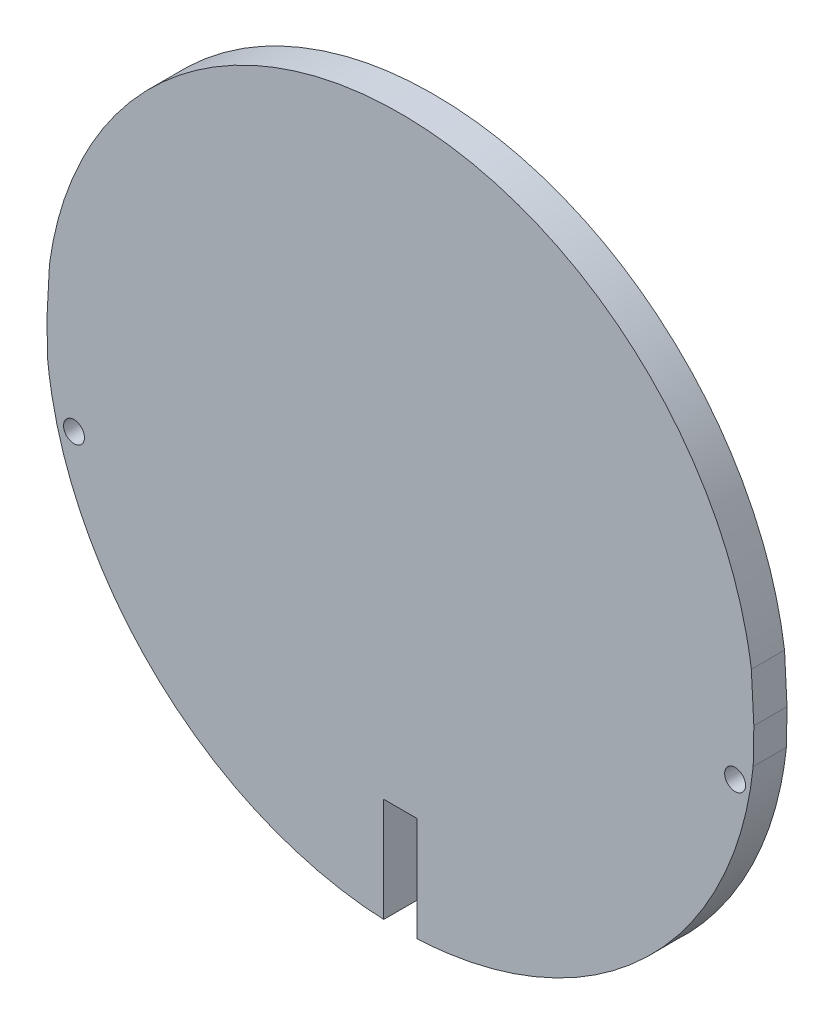
ISO-10303-21;
HEADER;
FILE_DESCRIPTION(('STEP AP214'),'2;1');
FILE_NAME('part.step','',(''),(''),'','','');
FILE_SCHEMA(('AUTOMOTIVE_DESIGN { 1 0 10303 214 1 1 1 1 }'));
ENDSEC;
DATA;
#1=APPLICATION_CONTEXT('core data for automotive mechanical design processes');
#2=APPLICATION_PROTOCOL_DEFINITION('international standard','automotive_design',2000,#1);
#3=PRODUCT_CONTEXT('',#1,'mechanical');
#4=PRODUCT('Part','Part','',(#3));
#5=PRODUCT_RELATED_PRODUCT_CATEGORY('part','',(#4));
#6=PRODUCT_DEFINITION_FORMATION('','',#4);
#7=PRODUCT_DEFINITION_CONTEXT('part definition',#1,'design');
#8=PRODUCT_DEFINITION('design','',#6,#7);
#9=PRODUCT_DEFINITION_SHAPE('','',#8);
#10=(LENGTH_UNIT() NAMED_UNIT(*) SI_UNIT(.MILLI.,.METRE.));
#11=(NAMED_UNIT(*) PLANE_ANGLE_UNIT() SI_UNIT($,.RADIAN.));
#12=(NAMED_UNIT(*) SI_UNIT($,.STERADIAN.) SOLID_ANGLE_UNIT());
#13=UNCERTAINTY_MEASURE_WITH_UNIT(LENGTH_MEASURE(1.E-05),#10,'distance_accuracy_value','');
#14=(GEOMETRIC_REPRESENTATION_CONTEXT(3) GLOBAL_UNCERTAINTY_ASSIGNED_CONTEXT((#13)) GLOBAL_UNIT_ASSIGNED_CONTEXT((#10,
#11,#12)) REPRESENTATION_CONTEXT('',''));
#15=CARTESIAN_POINT('',(0.,0.,0.));
#16=DIRECTION('',(0.,0.,1.));
#17=DIRECTION('',(1.,0.,0.));
#18=AXIS2_PLACEMENT_3D('',#15,#16,#17);
#19=CARTESIAN_POINT('',(-33.7401472515028,-3.41884717440255,243.175));
#20=CARTESIAN_POINT('',(-33.5219134346699,-5.49673974408785,243.175));
#21=CARTESIAN_POINT('',(-33.1217586079544,-7.52360336030338,243.175));
#22=CARTESIAN_POINT('',(-32.2456554666281,-10.4865168297179,243.175));
#23=CARTESIAN_POINT('',(-31.7386470445697,-11.9486311258385,243.175));
#24=CARTESIAN_POINT('',(-31.1277553781005,-13.3816061089751,243.175));
#25=CARTESIAN_POINT('',(-30.6973662683452,-14.3304353467333,243.175));
#26=CARTESIAN_POINT('',(-30.4703785723469,-14.8019000588231,243.175));
#27=CARTESIAN_POINT('',(-29.2902117325403,-17.1196124406314,243.175));
#28=CARTESIAN_POINT('',(-27.6449305064317,-19.7403337772427,243.175));
#29=CARTESIAN_POINT('',(-25.646898465304,-22.1138572841173,243.175));
#30=CARTESIAN_POINT('',(-24.5883768170115,-23.2589191706647,243.175));
#31=CARTESIAN_POINT('',(-24.2247269148998,-23.6345217184511,243.175));
#32=CARTESIAN_POINT('',(-23.4820127847481,-24.3673271482495,243.175));
#33=CARTESIAN_POINT('',(-21.5901477401273,-26.1504244492688,243.175));
#34=CARTESIAN_POINT('',(-18.7056708268071,-28.3178618450069,243.175));
#35=CARTESIAN_POINT('',(-15.9807867113066,-29.8236057129874,243.175));
#36=CARTESIAN_POINT('',(-14.1070067716983,-30.7476866698165,243.175));
#37=CARTESIAN_POINT('',(-13.1527010835454,-31.164175695453,243.175));
#38=CARTESIAN_POINT('',(-10.2562424757701,-32.2793477501952,243.175));
#39=CARTESIAN_POINT('',(-7.77796089328067,-32.988270972225,243.175));
#40=CARTESIAN_POINT('',(-5.21433965591233,-33.4058998082986,243.175));
#41=CARTESIAN_POINT('',(-4.18196798537004,-33.5493200990036,243.175));
#42=CARTESIAN_POINT('',(-3.66132830753749,-33.6092558601464,243.175));
#43=CARTESIAN_POINT('',(-2.10453268143531,-33.7519977589989,243.175));
#44=CARTESIAN_POINT('',(-1.06921386927955,-33.7985427644596,243.175));
#45=CARTESIAN_POINT('',(2.02959764384909,-33.8016874715165,243.175));
#46=CARTESIAN_POINT('',(4.08596214071679,-33.6221162532679,243.175));
#47=CARTESIAN_POINT('',(7.15511700382936,-33.0587264934906,243.175));
#48=CARTESIAN_POINT('',(8.17808125657162,-32.8206708517667,243.175));
#49=CARTESIAN_POINT('',(10.1770009779513,-32.2565776331426,243.175));
#50=CARTESIAN_POINT('',(11.1581047667066,-31.9298887420901,243.175));
#51=CARTESIAN_POINT('',(14.0493649699348,-30.823232747779,243.175));
#52=CARTESIAN_POINT('',(15.9079360314546,-29.9178091814807,243.175));
#53=CARTESIAN_POINT('',(18.1367329395038,-28.5564061577701,243.175));
#54=CARTESIAN_POINT('',(18.5768891041864,-28.2730876142728,243.175));
#55=CARTESIAN_POINT('',(19.4387101347957,-27.6894607286162,243.175));
#56=CARTESIAN_POINT('',(20.7069732529225,-26.7865737608581,243.175));
#57=CARTESIAN_POINT('',(21.9036315165537,-25.8033664460532,243.175));
#58=CARTESIAN_POINT('',(23.438553372088,-24.4244221054054,243.175));
#59=CARTESIAN_POINT('',(24.5444118429601,-23.3393631645124,243.175));
#60=CARTESIAN_POINT('',(25.5786405388952,-22.1739559229024,243.175));
#61=CARTESIAN_POINT('',(26.251776295938,-21.3786776518443,243.175));
#62=CARTESIAN_POINT('',(26.5809697228596,-20.9707785150517,243.175));
#63=CARTESIAN_POINT('',(28.1709466197994,-18.9029253335801,243.175));
#64=CARTESIAN_POINT('',(29.269671396597,-17.1528992217387,243.175));
#65=CARTESIAN_POINT('',(30.6789072870612,-14.3958682316347,243.175));
#66=CARTESIAN_POINT('',(31.1088211759449,-13.45484663067,243.175));
#67=CARTESIAN_POINT('',(31.8840533739668,-11.5260549877065,243.175));
#68=CARTESIAN_POINT('',(32.230015293159,-10.5349072164197,243.175));
#69=CARTESIAN_POINT('',(33.1196381142277,-7.53930280297371,243.175));
#70=CARTESIAN_POINT('',(33.5216512280803,-5.49956295766788,243.175));
#71=CARTESIAN_POINT('',(33.7401820483116,-3.41884711737329,243.175));
#72=B_SPLINE_CURVE_WITH_KNOTS('',3,(#19,#20,#21,#22,#23,#24,#25,#26,#27,#28,#29,#30,#31,#32,#33,
#34,#35,#36,#37,#38,#39,#40,#41,#42,#43,#44,#45,#46,#47,#48,#49,#50,#51,#52,#53,#54,#55,#56,#57,
#58,#59,#60,#61,#62,#63,#64,#65,#66,#67,#68,#69,#70,#71),.UNSPECIFIED.,.F.,.F.,(4,2,1,2,2,1,2,2,
1,1,2,2,1,2,2,2,2,2,2,2,2,1,2,1,2,2,2,2,2,4),(0.,0.0625000000000002,0.0937500000000003,0.109375,
0.125,0.187500000000001,0.218750000000001,0.234375000000001,0.250000000000001,0.312500000000001,
0.343750000000001,0.375000000000001,0.437500000000001,0.453125000000001,0.468750000000001,
0.500000000000001,0.5625,0.59375,0.625,0.6875,0.703125,0.71875,0.75,0.78125,0.796875,0.8125,
0.875,0.90625,0.9375,1.),.UNSPECIFIED.);
#73=DIRECTION('',(0.,0.,-1.));
#74=VECTOR('',#73,1.);
#75=SURFACE_OF_LINEAR_EXTRUSION('',#72,#74);
#76=CARTESIAN_POINT('',(33.7401820483116,-3.41884711737329,243.175));
#77=CARTESIAN_POINT('',(33.5216512280803,-5.49956295766788,243.175));
#78=CARTESIAN_POINT('',(33.1196381142277,-7.53930280297371,243.175));
#79=CARTESIAN_POINT('',(32.230015293159,-10.5349072164197,243.175));
#80=CARTESIAN_POINT('',(31.8840533739668,-11.5260549877065,243.175));
#81=CARTESIAN_POINT('',(31.1088211759449,-13.45484663067,243.175));
#82=CARTESIAN_POINT('',(30.6789072870612,-14.3958682316347,243.175));
#83=CARTESIAN_POINT('',(29.269671396597,-17.1528992217387,243.175));
#84=CARTESIAN_POINT('',(28.1709466197994,-18.9029253335801,243.175));
#85=CARTESIAN_POINT('',(26.5809697228596,-20.9707785150517,243.175));
#86=CARTESIAN_POINT('',(26.251776295938,-21.3786776518443,243.175));
#87=CARTESIAN_POINT('',(25.5786405388952,-22.1739559229024,243.175));
#88=CARTESIAN_POINT('',(24.5444118429601,-23.3393631645124,243.175));
#89=CARTESIAN_POINT('',(23.438553372088,-24.4244221054054,243.175));
#90=CARTESIAN_POINT('',(21.9036315165537,-25.8033664460532,243.175));
#91=CARTESIAN_POINT('',(20.7069732529225,-26.7865737608581,243.175));
#92=CARTESIAN_POINT('',(19.4387101347957,-27.6894607286162,243.175));
#93=CARTESIAN_POINT('',(18.5768891041864,-28.2730876142728,243.175));
#94=CARTESIAN_POINT('',(18.1367329395038,-28.5564061577701,243.175));
#95=CARTESIAN_POINT('',(15.9079360314546,-29.9178091814807,243.175));
#96=CARTESIAN_POINT('',(14.0493649699348,-30.823232747779,243.175));
#97=CARTESIAN_POINT('',(11.1581047667066,-31.9298887420901,243.175));
#98=CARTESIAN_POINT('',(10.1770009779513,-32.2565776331426,243.175));
#99=CARTESIAN_POINT('',(8.17808125657162,-32.8206708517667,243.175));
#100=CARTESIAN_POINT('',(7.15511700382936,-33.0587264934906,243.175));
#101=CARTESIAN_POINT('',(4.61834960027915,-33.5243884890041,243.175));
#102=CARTESIAN_POINT('',(3.09901772771896,-33.6949690704402,243.175));
#103=CARTESIAN_POINT('',(1.57437401267635,-33.7640769013447,243.175));
#104=B_SPLINE_CURVE_WITH_KNOTS('',3,(#76,#77,#78,#79,#80,#81,#82,#83,#84,#85,#86,#87,#88,#89,
#90,#91,#92,#93,#94,#95,#96,#97,#98,#99,#100,#101,#102,#103),.UNSPECIFIED.,.F.,.F.,(4,2,2,2,2,2,
1,2,1,2,2,2,2,2,4),(0.516262237182569,0.578762237182569,0.610012237182569,0.641262237182569,
0.703762237182569,0.719387237182569,0.735012237182569,0.766262237182569,0.797512237182569,
0.813137237182569,0.828762237182569,0.891262237182569,0.922512237182569,0.953762237182569,1.),.UNSPECIFIED.);
#105=CARTESIAN_POINT('',(1.57437295803338,-33.7640652873046,243.175));
#106=VERTEX_POINT('',#105);
#107=CARTESIAN_POINT('',(33.7401820483116,-3.41884711737329,243.175));
#108=VERTEX_POINT('',#107);
#109=EDGE_CURVE('E120',#106,#108,#104,.F.);
#110=ORIENTED_EDGE('',*,*,#109,.F.);
#111=DIRECTION('',(0.,0.,-1.));
#112=VECTOR('',#111,1.);
#113=CARTESIAN_POINT('',(1.57437295803364,-33.7640769491487,243.175));
#114=LINE('',#113,#112);
#115=CARTESIAN_POINT('',(1.57437358848927,-33.7640350669467,240.));
#116=VERTEX_POINT('',#115);
#117=EDGE_CURVE('E264',#106,#116,#114,.T.);
#118=ORIENTED_EDGE('',*,*,#117,.T.);
#119=CARTESIAN_POINT('',(1.57437548232633,-33.7640768347296,240.));
#120=CARTESIAN_POINT('',(3.09901870407212,-33.6949689608217,240.));
#121=CARTESIAN_POINT('',(4.61835008665123,-33.5243883997232,240.));
#122=CARTESIAN_POINT('',(7.15511700382936,-33.0587264934906,240.));
#123=CARTESIAN_POINT('',(8.17808125657162,-32.8206708517667,240.));
#124=CARTESIAN_POINT('',(10.1770009779513,-32.2565776331426,240.));
#125=CARTESIAN_POINT('',(11.1581047667066,-31.9298887420901,240.));
#126=CARTESIAN_POINT('',(14.0493649699348,-30.823232747779,240.));
#127=CARTESIAN_POINT('',(15.9079360314546,-29.9178091814807,240.));
#128=CARTESIAN_POINT('',(18.1367329395038,-28.5564061577701,240.));
#129=CARTESIAN_POINT('',(18.5768891041864,-28.2730876142728,240.));
#130=CARTESIAN_POINT('',(19.4387101347957,-27.6894607286162,240.));
#131=CARTESIAN_POINT('',(20.7069732529225,-26.7865737608581,240.));
#132=CARTESIAN_POINT('',(21.9036315165537,-25.8033664460532,240.));
#133=CARTESIAN_POINT('',(23.438553372088,-24.4244221054054,240.));
#134=CARTESIAN_POINT('',(24.5444118429601,-23.3393631645124,240.));
#135=CARTESIAN_POINT('',(25.5786405388952,-22.1739559229024,240.));
#136=CARTESIAN_POINT('',(26.251776295938,-21.3786776518443,240.));
#137=CARTESIAN_POINT('',(26.5809697228596,-20.9707785150517,240.));
#138=CARTESIAN_POINT('',(28.1709466197994,-18.9029253335801,240.));
#139=CARTESIAN_POINT('',(29.269671396597,-17.1528992217387,240.));
#140=CARTESIAN_POINT('',(30.6789072870612,-14.3958682316347,240.));
#141=CARTESIAN_POINT('',(31.1088211759449,-13.45484663067,240.));
#142=CARTESIAN_POINT('',(31.8840533739668,-11.5260549877065,240.));
#143=CARTESIAN_POINT('',(32.230015293159,-10.5349072164197,240.));
#144=CARTESIAN_POINT('',(33.1196381142277,-7.53930280297371,240.));
#145=CARTESIAN_POINT('',(33.5216512280803,-5.49956295766788,240.));
#146=CARTESIAN_POINT('',(33.7401820483116,-3.41884711737329,240.));
#147=B_SPLINE_CURVE_WITH_KNOTS('',3,(#119,#120,#121,#122,#123,#124,#125,#126,#127,#128,#129,
#130,#131,#132,#133,#134,#135,#136,#137,#138,#139,#140,#141,#142,#143,#144,#145,#146),
.UNSPECIFIED.,.F.,.F.,(4,2,2,2,2,2,1,2,1,2,2,2,2,2,4),(0.516262252039227,0.5625,0.59375,0.625,
0.6875,0.703125,0.71875,0.75,0.78125,0.796875,0.8125,0.875,0.90625,0.9375,1.),.UNSPECIFIED.);
#148=CARTESIAN_POINT('',(33.7401820483116,-3.41884711737329,240.));
#149=VERTEX_POINT('',#148);
#150=EDGE_CURVE('E234',#116,#149,#147,.T.);
#151=ORIENTED_EDGE('',*,*,#150,.T.);
#152=DIRECTION('',(0.,0.,-1.));
#153=VECTOR('',#152,1.);
#154=CARTESIAN_POINT('',(33.7401820483116,-3.41884711737329,243.175));
#155=LINE('',#154,#153);
#156=EDGE_CURVE('E133',#108,#149,#155,.T.);
#157=ORIENTED_EDGE('',*,*,#156,.F.);
#158=EDGE_LOOP('',(#110,#118,#151,#157));
#159=FACE_BOUND('',#158,.T.);
#160=ADVANCED_FACE('F38',(#159),#75,.F.);
#161=CARTESIAN_POINT('',(-33.560377663928,4.54613955192814,243.175));
#162=DIRECTION('',(0.998629534754574,-0.052335956242939,0.));
#163=DIRECTION('',(0.052335956242939,0.998629534754574,0.));
#164=AXIS2_PLACEMENT_3D('',#161,#162,#163);
#165=PLANE('',#164);
#166=DIRECTION('',(-0.052335956242939,-0.998629534754574,0.));
#167=VECTOR('',#166,1.);
#168=CARTESIAN_POINT('',(-33.560377663928,4.54613955192814,240.));
#169=LINE('',#168,#167);
#170=CARTESIAN_POINT('',(-33.560377663928,4.54613955192816,240.));
#171=VERTEX_POINT('',#170);
#172=CARTESIAN_POINT('',(-33.7995254554744,-0.0170721471381322,240.));
#173=VERTEX_POINT('',#172);
#174=EDGE_CURVE('E250',#171,#173,#169,.T.);
#175=ORIENTED_EDGE('',*,*,#174,.T.);
#176=DIRECTION('',(0.,0.,-1.));
#177=VECTOR('',#176,1.);
#178=CARTESIAN_POINT('',(-33.7995254554744,-0.0170721471381322,243.175));
#179=LINE('',#178,#177);
#180=CARTESIAN_POINT('',(-33.7995254554744,-0.0170721471381322,243.175));
#181=VERTEX_POINT('',#180);
#182=EDGE_CURVE('E189',#181,#173,#179,.T.);
#183=ORIENTED_EDGE('',*,*,#182,.F.);
#184=DIRECTION('',(-0.052335956242939,-0.998629534754574,0.));
#185=VECTOR('',#184,1.);
#186=CARTESIAN_POINT('',(-33.560377663928,4.54613955192814,243.175));
#187=LINE('',#186,#185);
#188=CARTESIAN_POINT('',(-33.560377663928,4.54613955192816,243.175));
#189=VERTEX_POINT('',#188);
#190=EDGE_CURVE('E153',#189,#181,#187,.T.);
#191=ORIENTED_EDGE('',*,*,#190,.F.);
#192=DIRECTION('',(0.,0.,-1.));
#193=VECTOR('',#192,1.);
#194=CARTESIAN_POINT('',(-33.560377663928,4.54613955192816,243.175));
#195=LINE('',#194,#193);
#196=EDGE_CURVE('E138',#189,#171,#195,.T.);
#197=ORIENTED_EDGE('',*,*,#196,.T.);
#198=EDGE_LOOP('',(#175,#183,#191,#197));
#199=FACE_BOUND('',#198,.T.);
#200=ADVANCED_FACE('F40',(#199),#165,.F.);
#201=CARTESIAN_POINT('',(-33.7995254554744,-0.0170721471381322,243.175));
#202=DIRECTION('',(0.999847695156393,0.0174524064371546,0.));
#203=DIRECTION('',(-0.0174524064371546,0.999847695156394,0.));
#204=AXIS2_PLACEMENT_3D('',#201,#202,#203);
#205=PLANE('',#204);
#206=DIRECTION('',(0.0174524064371546,-0.999847695156394,0.));
#207=VECTOR('',#206,1.);
#208=CARTESIAN_POINT('',(-33.7995254554744,-0.0170721471381322,240.));
#209=LINE('',#208,#207);
#210=CARTESIAN_POINT('',(-33.7401472515028,-3.41884717440255,240.));
#211=VERTEX_POINT('',#210);
#212=EDGE_CURVE('E242',#173,#211,#209,.T.);
#213=ORIENTED_EDGE('',*,*,#212,.T.);
#214=DIRECTION('',(0.,0.,-1.));
#215=VECTOR('',#214,1.);
#216=CARTESIAN_POINT('',(-33.7401472515028,-3.41884717440255,243.175));
#217=LINE('',#216,#215);
#218=CARTESIAN_POINT('',(-33.7401472515028,-3.41884717440255,243.175));
#219=VERTEX_POINT('',#218);
#220=EDGE_CURVE('E191',#219,#211,#217,.T.);
#221=ORIENTED_EDGE('',*,*,#220,.F.);
#222=DIRECTION('',(0.0174524064371546,-0.999847695156394,0.));
#223=VECTOR('',#222,1.);
#224=CARTESIAN_POINT('',(-33.7995254554744,-0.0170721471381322,243.175));
#225=LINE('',#224,#223);
#226=EDGE_CURVE('E103',#181,#219,#225,.T.);
#227=ORIENTED_EDGE('',*,*,#226,.F.);
#228=ORIENTED_EDGE('',*,*,#182,.T.);
#229=EDGE_LOOP('',(#213,#221,#227,#228));
#230=FACE_BOUND('',#229,.T.);
#231=ADVANCED_FACE('F275',(#230),#205,.F.);
#232=CARTESIAN_POINT('',(-33.7401472515028,-3.41884717440255,240.));
#233=CARTESIAN_POINT('',(-33.5219134346699,-5.49673974408785,240.));
#234=CARTESIAN_POINT('',(-33.1217586079544,-7.52360336030338,240.));
#235=CARTESIAN_POINT('',(-32.2456554666281,-10.4865168297179,240.));
#236=CARTESIAN_POINT('',(-31.7386470445697,-11.9486311258385,240.));
#237=CARTESIAN_POINT('',(-31.1277553781005,-13.3816061089751,240.));
#238=CARTESIAN_POINT('',(-30.6973662683452,-14.3304353467333,240.));
#239=CARTESIAN_POINT('',(-30.4703785723469,-14.8019000588231,240.));
#240=CARTESIAN_POINT('',(-29.2902117325403,-17.1196124406314,240.));
#241=CARTESIAN_POINT('',(-27.6449305064317,-19.7403337772427,240.));
#242=CARTESIAN_POINT('',(-25.646898465304,-22.1138572841173,240.));
#243=CARTESIAN_POINT('',(-24.5883768170115,-23.2589191706647,240.));
#244=CARTESIAN_POINT('',(-24.2247269148998,-23.6345217184511,240.));
#245=CARTESIAN_POINT('',(-23.4820127847481,-24.3673271482495,240.));
#246=CARTESIAN_POINT('',(-21.5901477401273,-26.1504244492688,240.));
#247=CARTESIAN_POINT('',(-18.7056708268071,-28.3178618450069,240.));
#248=CARTESIAN_POINT('',(-15.9807867113066,-29.8236057129874,240.));
#249=CARTESIAN_POINT('',(-14.1070067716983,-30.7476866698165,240.));
#250=CARTESIAN_POINT('',(-13.1527010835454,-31.164175695453,240.));
#251=CARTESIAN_POINT('',(-10.2562424757701,-32.2793477501952,240.));
#252=CARTESIAN_POINT('',(-7.77796089328067,-32.988270972225,240.));
#253=CARTESIAN_POINT('',(-5.21433965591233,-33.4058998082986,240.));
#254=CARTESIAN_POINT('',(-4.18196798537004,-33.5493200990036,240.));
#255=CARTESIAN_POINT('',(-3.66132830753749,-33.6092558601464,240.));
#256=CARTESIAN_POINT('',(-2.62785466297365,-33.704014599165,240.));
#257=CARTESIAN_POINT('',(-2.1139384090079,-33.7392434143478,240.));
#258=CARTESIAN_POINT('',(-1.60062777177367,-33.7629030620113,240.));
#259=B_SPLINE_CURVE_WITH_KNOTS('',3,(#232,#233,#234,#235,#236,#237,#238,#239,#240,#241,#242,
#243,#244,#245,#246,#247,#248,#249,#250,#251,#252,#253,#254,#255,#256,#257,#258),.UNSPECIFIED.,
.F.,.F.,(4,2,1,2,2,1,2,2,1,1,2,2,1,2,2,4),(0.,0.0625000000000002,0.0937500000000003,0.109375,
0.125,0.187500000000001,0.218750000000001,0.234375000000001,0.250000000000001,0.312500000000001,
0.343750000000001,0.375000000000001,0.437500000000001,0.453125000000001,0.468750000000001,
0.48424281423116),.UNSPECIFIED.);
#260=CARTESIAN_POINT('',(-1.60062740667777,-33.762895145218,240.));
#261=VERTEX_POINT('',#260);
#262=EDGE_CURVE('E254',#211,#261,#259,.T.);
#263=ORIENTED_EDGE('',*,*,#262,.T.);
#264=DIRECTION('',(0.,0.,-1.));
#265=VECTOR('',#264,1.);
#266=CARTESIAN_POINT('',(-1.60062704196662,-33.7629030956497,243.175));
#267=LINE('',#266,#265);
#268=CARTESIAN_POINT('',(-1.60062704196662,-33.7628791944388,243.175));
#269=VERTEX_POINT('',#268);
#270=EDGE_CURVE('E56',#261,#269,#267,.F.);
#271=ORIENTED_EDGE('',*,*,#270,.T.);
#272=CARTESIAN_POINT('',(-1.60062923978061,-33.7629029943475,243.175));
#273=CARTESIAN_POINT('',(-2.11393938883385,-33.739243347181,243.175));
#274=CARTESIAN_POINT('',(-2.62785515348293,-33.7040145541904,243.175));
#275=CARTESIAN_POINT('',(-3.66132830753749,-33.6092558601464,243.175));
#276=CARTESIAN_POINT('',(-4.18196798537004,-33.5493200990036,243.175));
#277=CARTESIAN_POINT('',(-5.21433965591233,-33.4058998082986,243.175));
#278=CARTESIAN_POINT('',(-7.77796089328067,-32.988270972225,243.175));
#279=CARTESIAN_POINT('',(-10.2562424757701,-32.2793477501952,243.175));
#280=CARTESIAN_POINT('',(-13.1527010835454,-31.164175695453,243.175));
#281=CARTESIAN_POINT('',(-14.1070067716983,-30.7476866698165,243.175));
#282=CARTESIAN_POINT('',(-15.9807867113066,-29.8236057129874,243.175));
#283=CARTESIAN_POINT('',(-18.7056708268071,-28.3178618450069,243.175));
#284=CARTESIAN_POINT('',(-21.5901477401273,-26.1504244492688,243.175));
#285=CARTESIAN_POINT('',(-23.4820127847481,-24.3673271482495,243.175));
#286=CARTESIAN_POINT('',(-24.2247269148998,-23.6345217184511,243.175));
#287=CARTESIAN_POINT('',(-24.5883768170115,-23.2589191706647,243.175));
#288=CARTESIAN_POINT('',(-25.646898465304,-22.1138572841173,243.175));
#289=CARTESIAN_POINT('',(-27.6449305064317,-19.7403337772427,243.175));
#290=CARTESIAN_POINT('',(-29.2902117325403,-17.1196124406314,243.175));
#291=CARTESIAN_POINT('',(-30.4703785723469,-14.8019000588231,243.175));
#292=CARTESIAN_POINT('',(-30.6973662683452,-14.3304353467333,243.175));
#293=CARTESIAN_POINT('',(-31.1277553781005,-13.3816061089751,243.175));
#294=CARTESIAN_POINT('',(-31.7386470445697,-11.9486311258385,243.175));
#295=CARTESIAN_POINT('',(-32.2456554666281,-10.4865168297179,243.175));
#296=CARTESIAN_POINT('',(-33.1217586079544,-7.52360336030338,243.175));
#297=CARTESIAN_POINT('',(-33.5219134346699,-5.49673974408785,243.175));
#298=CARTESIAN_POINT('',(-33.7401472515028,-3.41884717440255,243.175));
#299=B_SPLINE_CURVE_WITH_KNOTS('',3,(#272,#273,#274,#275,#276,#277,#278,#279,#280,#281,#282,
#283,#284,#285,#286,#287,#288,#289,#290,#291,#292,#293,#294,#295,#296,#297,#298),.UNSPECIFIED.,
.F.,.F.,(4,2,2,1,2,2,1,1,2,2,1,2,2,1,2,4),(0.,0.0154927994619622,0.0311177994619622,
0.0467427994619622,0.109242799461962,0.140492799461962,0.171742799461962,0.234242799461962,
0.249867799461962,0.265492799461962,0.296742799461962,0.359242799461962,0.374867799461962,
0.390492799461963,0.421742799461963,0.484242799461963),.UNSPECIFIED.);
#300=EDGE_CURVE('E124',#219,#269,#299,.F.);
#301=ORIENTED_EDGE('',*,*,#300,.F.);
#302=ORIENTED_EDGE('',*,*,#220,.T.);
#303=EDGE_LOOP('',(#263,#271,#301,#302));
#304=FACE_BOUND('',#303,.T.);
#305=ADVANCED_FACE('F277',(#304),#75,.F.);
#306=CARTESIAN_POINT('',(33.7401820483116,-3.41884711737331,243.175));
#307=DIRECTION('',(-0.999847695156391,0.0174524064372837,0.));
#308=DIRECTION('',(-0.0174524064372837,-0.999847695156391,0.));
#309=AXIS2_PLACEMENT_3D('',#306,#307,#308);
#310=PLANE('',#309);
#311=DIRECTION('',(0.0174524064372837,0.999847695156391,0.));
#312=VECTOR('',#311,1.);
#313=CARTESIAN_POINT('',(33.7401820483116,-3.41884711737331,240.));
#314=LINE('',#313,#312);
#315=CARTESIAN_POINT('',(33.7995602512882,-0.0170721471381168,240.));
#316=VERTEX_POINT('',#315);
#317=EDGE_CURVE('E130',#149,#316,#314,.T.);
#318=ORIENTED_EDGE('',*,*,#317,.T.);
#319=DIRECTION('',(0.,0.,-1.));
#320=VECTOR('',#319,1.);
#321=CARTESIAN_POINT('',(33.7995602512882,-0.0170721471381168,243.175));
#322=LINE('',#321,#320);
#323=CARTESIAN_POINT('',(33.7995602512882,-0.0170721471381168,243.175));
#324=VERTEX_POINT('',#323);
#325=EDGE_CURVE('E127',#324,#316,#322,.T.);
#326=ORIENTED_EDGE('',*,*,#325,.F.);
#327=DIRECTION('',(0.0174524064372837,0.999847695156391,0.));
#328=VECTOR('',#327,1.);
#329=CARTESIAN_POINT('',(33.7401820483116,-3.41884711737331,243.175));
#330=LINE('',#329,#328);
#331=EDGE_CURVE('E112',#108,#324,#330,.T.);
#332=ORIENTED_EDGE('',*,*,#331,.F.);
#333=ORIENTED_EDGE('',*,*,#156,.T.);
#334=EDGE_LOOP('',(#318,#326,#332,#333));
#335=FACE_BOUND('',#334,.T.);
#336=ADVANCED_FACE('F128',(#335),#310,.F.);
#337=CARTESIAN_POINT('',(33.7995602512882,-0.0170721471381168,243.175));
#338=DIRECTION('',(-0.998629534754574,-0.0523359562429329,0.));
#339=DIRECTION('',(0.0523359562429329,-0.998629534754574,0.));
#340=AXIS2_PLACEMENT_3D('',#337,#338,#339);
#341=PLANE('',#340);
#342=DIRECTION('',(-0.0523359562429329,0.998629534754574,0.));
#343=VECTOR('',#342,1.);
#344=CARTESIAN_POINT('',(33.7995602512882,-0.0170721471381168,240.));
#345=LINE('',#344,#343);
#346=CARTESIAN_POINT('',(33.5604124567753,4.54613960853345,240.));
#347=VERTEX_POINT('',#346);
#348=EDGE_CURVE('E253',#316,#347,#345,.T.);
#349=ORIENTED_EDGE('',*,*,#348,.T.);
#350=DIRECTION('',(0.,0.,-1.));
#351=VECTOR('',#350,1.);
#352=CARTESIAN_POINT('',(33.5604124567753,4.54613960853345,243.175));
#353=LINE('',#352,#351);
#354=CARTESIAN_POINT('',(33.5604124567753,4.54613960853345,243.175));
#355=VERTEX_POINT('',#354);
#356=EDGE_CURVE('E134',#355,#347,#353,.T.);
#357=ORIENTED_EDGE('',*,*,#356,.F.);
#358=DIRECTION('',(-0.0523359562429329,0.998629534754574,0.));
#359=VECTOR('',#358,1.);
#360=CARTESIAN_POINT('',(33.7995602512882,-0.0170721471381168,243.175));
#361=LINE('',#360,#359);
#362=EDGE_CURVE('E117',#324,#355,#361,.T.);
#363=ORIENTED_EDGE('',*,*,#362,.F.);
#364=ORIENTED_EDGE('',*,*,#325,.T.);
#365=EDGE_LOOP('',(#349,#357,#363,#364));
#366=FACE_BOUND('',#365,.T.);
#367=ADVANCED_FACE('F136',(#366),#341,.F.);
#368=CARTESIAN_POINT('',(33.5604124567753,4.54613960853345,243.175));
#369=CARTESIAN_POINT('',(33.2820653987906,6.56737437943534,243.175));
#370=CARTESIAN_POINT('',(32.8313728032903,8.53423069122965,243.175));
#371=CARTESIAN_POINT('',(31.8946269220487,11.4022568974663,243.175));
#372=CARTESIAN_POINT('',(31.3610874010579,12.8157086429951,243.175));
#373=CARTESIAN_POINT('',(30.7294917793295,14.1982217304009,243.175));
#374=CARTESIAN_POINT('',(30.2866101478498,15.1130131439712,243.175));
#375=CARTESIAN_POINT('',(30.0537010753112,15.5679250066728,243.175));
#376=CARTESIAN_POINT('',(28.8457427014744,17.8052952917493,243.175));
#377=CARTESIAN_POINT('',(27.7361738495733,19.4878372692615,243.175));
#378=CARTESIAN_POINT('',(25.8528558013397,21.8474990802839,243.175));
#379=CARTESIAN_POINT('',(25.188593752061,22.6066980612392,243.175));
#380=CARTESIAN_POINT('',(23.786460552021,24.0699135432291,243.175));
#381=CARTESIAN_POINT('',(23.0450594456398,24.7766408289273,243.175));
#382=CARTESIAN_POINT('',(20.7523281348932,26.7782840290484,243.175));
#383=CARTESIAN_POINT('',(18.3110677460307,28.5581591218249,243.175));
#384=CARTESIAN_POINT('',(15.6406478983997,29.9958772437517,243.175));
#385=CARTESIAN_POINT('',(14.2667399957213,30.6569565242211,243.175));
#386=CARTESIAN_POINT('',(13.8011410837962,30.8681630079769,243.175));
#387=CARTESIAN_POINT('',(12.8647588873635,31.2679718529554,243.175));
#388=CARTESIAN_POINT('',(12.3936994612774,31.4567831926255,243.175));
#389=CARTESIAN_POINT('',(10.0246059650265,32.3474832889447,243.175));
#390=CARTESIAN_POINT('',(7.11527976519426,33.1594712998069,243.175));
#391=CARTESIAN_POINT('',(4.10232218038758,33.570671259807,243.175));
#392=CARTESIAN_POINT('',(2.07021332223554,33.7540339641368,243.175));
#393=CARTESIAN_POINT('',(1.05366216131143,33.7991469509523,243.175));
#394=CARTESIAN_POINT('',(-1.97866322866921,33.8028023855291,243.175));
#395=CARTESIAN_POINT('',(-4.48722038602584,33.5876812691688,243.175));
#396=CARTESIAN_POINT('',(-6.9715007299331,33.0844091869291,243.175));
#397=CARTESIAN_POINT('',(-7.96324362195128,32.8597266107306,243.175));
#398=CARTESIAN_POINT('',(-8.4593996147349,32.7353306897467,243.175));
#399=CARTESIAN_POINT('',(-9.93366921730277,32.3298054351655,243.175));
#400=CARTESIAN_POINT('',(-10.8973653065333,32.016750487259,243.175));
#401=CARTESIAN_POINT('',(-13.7346096462486,30.9575148612428,243.175));
#402=CARTESIAN_POINT('',(-15.554750032773,30.0922358140582,243.175));
#403=CARTESIAN_POINT('',(-17.7346735714331,28.7982272511699,243.175));
#404=CARTESIAN_POINT('',(-18.1658935427174,28.5288002804764,243.175));
#405=CARTESIAN_POINT('',(-19.0186453742721,27.9683420633217,243.175));
#406=CARTESIAN_POINT('',(-19.4391876131215,27.677889019477,243.175));
#407=CARTESIAN_POINT('',(-20.6739523625416,26.7831794449682,243.175));
#408=CARTESIAN_POINT('',(-21.4652076756434,26.1530693842164,243.175));
#409=CARTESIAN_POINT('',(-23.7487172604649,24.1676313965341,243.175));
#410=CARTESIAN_POINT('',(-25.151109466385,22.7176111466286,243.175));
#411=CARTESIAN_POINT('',(-26.7425075256197,20.7348077476841,243.175));
#412=CARTESIAN_POINT('',(-27.0534367564324,20.3287028351869,243.175));
#413=CARTESIAN_POINT('',(-27.6549586448929,19.5045017591262,243.175));
#414=CARTESIAN_POINT('',(-28.5256821856912,18.2520117565887,243.175));
#415=CARTESIAN_POINT('',(-29.3043492989201,16.9523012646445,243.175));
#416=CARTESIAN_POINT('',(-30.7454836560348,14.293275374893,243.175));
#417=CARTESIAN_POINT('',(-31.551336522558,12.4411335201558,243.175));
#418=CARTESIAN_POINT('',(-32.506911863443,9.53303936882196,243.175));
#419=CARTESIAN_POINT('',(-32.7810553240917,8.54772864691103,243.175));
#420=CARTESIAN_POINT('',(-33.2376341924846,6.56190951935685,243.175));
#421=CARTESIAN_POINT('',(-33.4209052816291,5.55892536190125,243.175));
#422=CARTESIAN_POINT('',(-33.560377663928,4.54613955192816,243.175));
#423=B_SPLINE_CURVE_WITH_KNOTS('',3,(#368,#369,#370,#371,#372,#373,#374,#375,#376,#377,#378,
#379,#380,#381,#382,#383,#384,#385,#386,#387,#388,#389,#390,#391,#392,#393,#394,#395,#396,#397,
#398,#399,#400,#401,#402,#403,#404,#405,#406,#407,#408,#409,#410,#411,#412,#413,#414,#415,#416,
#417,#418,#419,#420,#421,#422),.UNSPECIFIED.,.F.,.F.,(4,2,1,2,2,2,2,2,1,2,2,2,1,2,2,1,2,2,2,2,2,
2,2,2,2,1,2,2,2,4),(0.,0.0625,0.09375,0.109375,0.125,0.1875,0.21875,0.25,0.3125,0.34375,
0.359375,0.375,0.4375,0.46875,0.5,0.5625,0.578125,0.59375,0.625,0.6875,0.703125,0.71875,0.75,
0.8125,0.828125,0.84375,0.875,0.9375,0.96875,1.),.UNSPECIFIED.);
#424=DIRECTION('',(0.,0.,-1.));
#425=VECTOR('',#424,1.);
#426=SURFACE_OF_LINEAR_EXTRUSION('',#423,#425);
#427=CARTESIAN_POINT('',(33.5604124567753,4.54613960853345,240.));
#428=CARTESIAN_POINT('',(33.2820653987906,6.56737437943534,240.));
#429=CARTESIAN_POINT('',(32.8313728032903,8.53423069122965,240.));
#430=CARTESIAN_POINT('',(31.8946269220487,11.4022568974663,240.));
#431=CARTESIAN_POINT('',(31.3610874010579,12.8157086429951,240.));
#432=CARTESIAN_POINT('',(30.7294917793295,14.1982217304009,240.));
#433=CARTESIAN_POINT('',(30.2866101478498,15.1130131439712,240.));
#434=CARTESIAN_POINT('',(30.0537010753112,15.5679250066728,240.));
#435=CARTESIAN_POINT('',(28.8457427014744,17.8052952917493,240.));
#436=CARTESIAN_POINT('',(27.7361738495733,19.4878372692615,240.));
#437=CARTESIAN_POINT('',(25.8528558013397,21.8474990802839,240.));
#438=CARTESIAN_POINT('',(25.188593752061,22.6066980612392,240.));
#439=CARTESIAN_POINT('',(23.786460552021,24.0699135432291,240.));
#440=CARTESIAN_POINT('',(23.0450594456398,24.7766408289273,240.));
#441=CARTESIAN_POINT('',(20.7523281348932,26.7782840290484,240.));
#442=CARTESIAN_POINT('',(18.3110677460307,28.5581591218249,240.));
#443=CARTESIAN_POINT('',(15.6406478983997,29.9958772437517,240.));
#444=CARTESIAN_POINT('',(14.2667399957213,30.6569565242211,240.));
#445=CARTESIAN_POINT('',(13.8011410837962,30.8681630079769,240.));
#446=CARTESIAN_POINT('',(12.8647588873635,31.2679718529554,240.));
#447=CARTESIAN_POINT('',(12.3936994612774,31.4567831926255,240.));
#448=CARTESIAN_POINT('',(10.0246059650265,32.3474832889447,240.));
#449=CARTESIAN_POINT('',(7.11527976519426,33.1594712998069,240.));
#450=CARTESIAN_POINT('',(4.10232218038758,33.570671259807,240.));
#451=CARTESIAN_POINT('',(2.07021332223554,33.7540339641368,240.));
#452=CARTESIAN_POINT('',(1.05366216131143,33.7991469509523,240.));
#453=CARTESIAN_POINT('',(-1.97866322866921,33.8028023855291,240.));
#454=CARTESIAN_POINT('',(-4.48722038602584,33.5876812691688,240.));
#455=CARTESIAN_POINT('',(-6.9715007299331,33.0844091869291,240.));
#456=CARTESIAN_POINT('',(-7.96324362195128,32.8597266107306,240.));
#457=CARTESIAN_POINT('',(-8.4593996147349,32.7353306897467,240.));
#458=CARTESIAN_POINT('',(-9.93366921730277,32.3298054351655,240.));
#459=CARTESIAN_POINT('',(-10.8973653065333,32.016750487259,240.));
#460=CARTESIAN_POINT('',(-13.7346096462486,30.9575148612428,240.));
#461=CARTESIAN_POINT('',(-15.554750032773,30.0922358140582,240.));
#462=CARTESIAN_POINT('',(-17.7346735714331,28.7982272511699,240.));
#463=CARTESIAN_POINT('',(-18.1658935427174,28.5288002804764,240.));
#464=CARTESIAN_POINT('',(-19.0186453742721,27.9683420633217,240.));
#465=CARTESIAN_POINT('',(-19.4391876131215,27.677889019477,240.));
#466=CARTESIAN_POINT('',(-20.6739523625416,26.7831794449682,240.));
#467=CARTESIAN_POINT('',(-21.4652076756434,26.1530693842164,240.));
#468=CARTESIAN_POINT('',(-23.7487172604649,24.1676313965341,240.));
#469=CARTESIAN_POINT('',(-25.151109466385,22.7176111466286,240.));
#470=CARTESIAN_POINT('',(-26.7425075256197,20.7348077476841,240.));
#471=CARTESIAN_POINT('',(-27.0534367564324,20.3287028351869,240.));
#472=CARTESIAN_POINT('',(-27.6549586448929,19.5045017591262,240.));
#473=CARTESIAN_POINT('',(-28.5256821856912,18.2520117565887,240.));
#474=CARTESIAN_POINT('',(-29.3043492989201,16.9523012646445,240.));
#475=CARTESIAN_POINT('',(-30.7454836560348,14.293275374893,240.));
#476=CARTESIAN_POINT('',(-31.551336522558,12.4411335201558,240.));
#477=CARTESIAN_POINT('',(-32.506911863443,9.53303936882196,240.));
#478=CARTESIAN_POINT('',(-32.7810553240917,8.54772864691103,240.));
#479=CARTESIAN_POINT('',(-33.2376341924846,6.56190951935685,240.));
#480=CARTESIAN_POINT('',(-33.4209052816291,5.55892536190125,240.));
#481=CARTESIAN_POINT('',(-33.560377663928,4.54613955192816,240.));
#482=B_SPLINE_CURVE_WITH_KNOTS('',3,(#427,#428,#429,#430,#431,#432,#433,#434,#435,#436,#437,
#438,#439,#440,#441,#442,#443,#444,#445,#446,#447,#448,#449,#450,#451,#452,#453,#454,#455,#456,
#457,#458,#459,#460,#461,#462,#463,#464,#465,#466,#467,#468,#469,#470,#471,#472,#473,#474,#475,
#476,#477,#478,#479,#480,#481),.UNSPECIFIED.,.F.,.F.,(4,2,1,2,2,2,2,2,1,2,2,2,1,2,2,1,2,2,2,2,2,
2,2,2,2,1,2,2,2,4),(0.,0.0625,0.09375,0.109375,0.125,0.1875,0.21875,0.25,0.3125,0.34375,
0.359375,0.375,0.4375,0.46875,0.5,0.5625,0.578125,0.59375,0.625,0.6875,0.703125,0.71875,0.75,
0.8125,0.828125,0.84375,0.875,0.9375,0.96875,1.),.UNSPECIFIED.);
#483=EDGE_CURVE('E93',#347,#171,#482,.T.);
#484=ORIENTED_EDGE('',*,*,#483,.T.);
#485=ORIENTED_EDGE('',*,*,#196,.F.);
#486=CARTESIAN_POINT('',(-33.560377663928,4.54613955192816,243.175));
#487=CARTESIAN_POINT('',(-33.4209052816291,5.55892536190125,243.175));
#488=CARTESIAN_POINT('',(-33.2376341924846,6.56190951935685,243.175));
#489=CARTESIAN_POINT('',(-32.7810553240917,8.54772864691103,243.175));
#490=CARTESIAN_POINT('',(-32.506911863443,9.53303936882196,243.175));
#491=CARTESIAN_POINT('',(-31.551336522558,12.4411335201558,243.175));
#492=CARTESIAN_POINT('',(-30.7454836560348,14.293275374893,243.175));
#493=CARTESIAN_POINT('',(-29.3043492989201,16.9523012646445,243.175));
#494=CARTESIAN_POINT('',(-28.5256821856912,18.2520117565887,243.175));
#495=CARTESIAN_POINT('',(-27.6549586448929,19.5045017591262,243.175));
#496=CARTESIAN_POINT('',(-27.0534367564324,20.3287028351869,243.175));
#497=CARTESIAN_POINT('',(-26.7425075256197,20.7348077476841,243.175));
#498=CARTESIAN_POINT('',(-25.151109466385,22.7176111466286,243.175));
#499=CARTESIAN_POINT('',(-23.7487172604649,24.1676313965341,243.175));
#500=CARTESIAN_POINT('',(-21.4652076756434,26.1530693842164,243.175));
#501=CARTESIAN_POINT('',(-20.6739523625416,26.7831794449682,243.175));
#502=CARTESIAN_POINT('',(-19.4391876131215,27.677889019477,243.175));
#503=CARTESIAN_POINT('',(-19.0186453742721,27.9683420633217,243.175));
#504=CARTESIAN_POINT('',(-18.1658935427174,28.5288002804764,243.175));
#505=CARTESIAN_POINT('',(-17.7346735714331,28.7982272511699,243.175));
#506=CARTESIAN_POINT('',(-15.554750032773,30.0922358140582,243.175));
#507=CARTESIAN_POINT('',(-13.7346096462486,30.9575148612428,243.175));
#508=CARTESIAN_POINT('',(-10.8973653065333,32.016750487259,243.175));
#509=CARTESIAN_POINT('',(-9.93366921730277,32.3298054351655,243.175));
#510=CARTESIAN_POINT('',(-8.4593996147349,32.7353306897467,243.175));
#511=CARTESIAN_POINT('',(-7.96324362195128,32.8597266107306,243.175));
#512=CARTESIAN_POINT('',(-6.9715007299331,33.0844091869291,243.175));
#513=CARTESIAN_POINT('',(-4.48722038602584,33.5876812691688,243.175));
#514=CARTESIAN_POINT('',(-1.97866322866921,33.8028023855291,243.175));
#515=CARTESIAN_POINT('',(1.05366216131143,33.7991469509523,243.175));
#516=CARTESIAN_POINT('',(2.07021332223554,33.7540339641368,243.175));
#517=CARTESIAN_POINT('',(4.10232218038758,33.570671259807,243.175));
#518=CARTESIAN_POINT('',(7.11527976519426,33.1594712998069,243.175));
#519=CARTESIAN_POINT('',(10.0246059650265,32.3474832889447,243.175));
#520=CARTESIAN_POINT('',(12.3936994612774,31.4567831926255,243.175));
#521=CARTESIAN_POINT('',(12.8647588873635,31.2679718529554,243.175));
#522=CARTESIAN_POINT('',(13.8011410837962,30.8681630079769,243.175));
#523=CARTESIAN_POINT('',(14.2667399957213,30.6569565242211,243.175));
#524=CARTESIAN_POINT('',(15.6406478983997,29.9958772437517,243.175));
#525=CARTESIAN_POINT('',(18.3110677460307,28.5581591218249,243.175));
#526=CARTESIAN_POINT('',(20.7523281348932,26.7782840290484,243.175));
#527=CARTESIAN_POINT('',(23.0450594456398,24.7766408289273,243.175));
#528=CARTESIAN_POINT('',(23.786460552021,24.0699135432291,243.175));
#529=CARTESIAN_POINT('',(25.188593752061,22.6066980612392,243.175));
#530=CARTESIAN_POINT('',(25.8528558013397,21.8474990802839,243.175));
#531=CARTESIAN_POINT('',(27.7361738495733,19.4878372692615,243.175));
#532=CARTESIAN_POINT('',(28.8457427014744,17.8052952917493,243.175));
#533=CARTESIAN_POINT('',(30.0537010753112,15.5679250066728,243.175));
#534=CARTESIAN_POINT('',(30.2866101478498,15.1130131439712,243.175));
#535=CARTESIAN_POINT('',(30.7294917793295,14.1982217304009,243.175));
#536=CARTESIAN_POINT('',(31.3610874010579,12.8157086429951,243.175));
#537=CARTESIAN_POINT('',(31.8946269220487,11.4022568974663,243.175));
#538=CARTESIAN_POINT('',(32.8313728032903,8.53423069122965,243.175));
#539=CARTESIAN_POINT('',(33.2820653987906,6.56737437943534,243.175));
#540=CARTESIAN_POINT('',(33.5604124567753,4.54613960853345,243.175));
#541=B_SPLINE_CURVE_WITH_KNOTS('',3,(#486,#487,#488,#489,#490,#491,#492,#493,#494,#495,#496,
#497,#498,#499,#500,#501,#502,#503,#504,#505,#506,#507,#508,#509,#510,#511,#512,#513,#514,#515,
#516,#517,#518,#519,#520,#521,#522,#523,#524,#525,#526,#527,#528,#529,#530,#531,#532,#533,#534,
#535,#536,#537,#538,#539,#540),.UNSPECIFIED.,.F.,.F.,(4,2,2,2,1,2,2,2,2,2,2,2,2,2,1,2,2,1,2,2,2,
1,2,2,2,2,2,1,2,4),(0.,0.03125,0.0625,0.125,0.15625,0.171875,0.1875,0.25,0.28125,0.296875,
0.3125,0.375,0.40625,0.421875,0.4375,0.5,0.53125,0.5625,0.625,0.640625,0.65625,0.6875,0.75,
0.78125,0.8125,0.875,0.890625,0.90625,0.9375,1.),.UNSPECIFIED.);
#542=EDGE_CURVE('E65',#355,#189,#541,.F.);
#543=ORIENTED_EDGE('',*,*,#542,.F.);
#544=ORIENTED_EDGE('',*,*,#356,.T.);
#545=EDGE_LOOP('',(#484,#485,#543,#544));
#546=FACE_BOUND('',#545,.T.);
#547=ADVANCED_FACE('F161',(#546),#426,.F.);
#548=CARTESIAN_POINT('',(-0.0362766982367262,-33.7995910001452,243.175));
#549=DIRECTION('',(0.,0.,-1.));
#550=DIRECTION('',(-1.,0.,0.));
#551=AXIS2_PLACEMENT_3D('',#548,#549,#550);
#552=PLANE('',#551);
#553=CARTESIAN_POINT('',(32.0093023749139,-5.35898951564747,243.175));
#554=DIRECTION('',(0.,0.,1.));
#555=DIRECTION('',(1.,0.,0.));
#556=AXIS2_PLACEMENT_3D('',#553,#554,#555);
#557=CIRCLE('',#556,0.999999999998764);
#558=CARTESIAN_POINT('',(33.0093023749126,-5.35898951564747,243.175));
#559=VERTEX_POINT('',#558);
#560=EDGE_CURVE('E323',#559,#559,#557,.T.);
#561=ORIENTED_EDGE('',*,*,#560,.F.);
#562=EDGE_LOOP('',(#561));
#563=FACE_BOUND('',#562,.T.);
#564=CARTESIAN_POINT('',(-31.2160643993176,-8.16443665346959,243.175));
#565=DIRECTION('',(0.,0.,1.));
#566=DIRECTION('',(1.,0.,0.));
#567=AXIS2_PLACEMENT_3D('',#564,#565,#566);
#568=CIRCLE('',#567,1.);
#569=CARTESIAN_POINT('',(-30.2160643993176,-8.16443665346959,243.175));
#570=VERTEX_POINT('',#569);
#571=EDGE_CURVE('E337',#570,#570,#568,.T.);
#572=ORIENTED_EDGE('',*,*,#571,.F.);
#573=EDGE_LOOP('',(#572));
#574=FACE_BOUND('',#573,.T.);
#575=DIRECTION('',(-1.,0.,0.));
#576=VECTOR('',#575,1.);
#577=CARTESIAN_POINT('',(-1.60062704196662,-23.7996045123723,243.175));
#578=LINE('',#577,#576);
#579=CARTESIAN_POINT('',(1.57437295803338,-23.7996045123723,243.175));
#580=VERTEX_POINT('',#579);
#581=CARTESIAN_POINT('',(-1.60062704196662,-23.7996045123723,243.175));
#582=VERTEX_POINT('',#581);
#583=EDGE_CURVE('E310',#580,#582,#578,.T.);
#584=ORIENTED_EDGE('',*,*,#583,.F.);
#585=DIRECTION('',(0.,1.,0.));
#586=VECTOR('',#585,1.);
#587=CARTESIAN_POINT('',(1.57437295803338,-34.7701759650406,243.175));
#588=LINE('',#587,#586);
#589=EDGE_CURVE('E295',#106,#580,#588,.T.);
#590=ORIENTED_EDGE('',*,*,#589,.F.);
#591=ORIENTED_EDGE('',*,*,#109,.T.);
#592=ORIENTED_EDGE('',*,*,#331,.T.);
#593=ORIENTED_EDGE('',*,*,#362,.T.);
#594=ORIENTED_EDGE('',*,*,#542,.T.);
#595=ORIENTED_EDGE('',*,*,#190,.T.);
#596=ORIENTED_EDGE('',*,*,#226,.T.);
#597=ORIENTED_EDGE('',*,*,#300,.T.);
#598=DIRECTION('',(0.,-1.,0.));
#599=VECTOR('',#598,1.);
#600=CARTESIAN_POINT('',(-1.60062704196662,-23.7996045123723,243.175));
#601=LINE('',#600,#599);
#602=EDGE_CURVE('E290',#582,#269,#601,.T.);
#603=ORIENTED_EDGE('',*,*,#602,.F.);
#604=EDGE_LOOP('',(#584,#590,#591,#592,#593,#594,#595,#596,#597,#603));
#605=FACE_BOUND('',#604,.T.);
#606=ADVANCED_FACE('F115',(#563,#574,#605),#552,.F.);
#607=CARTESIAN_POINT('',(-0.0362766982367262,-33.7995910001452,240.));
#608=DIRECTION('',(0.,0.,-1.));
#609=DIRECTION('',(-1.,0.,0.));
#610=AXIS2_PLACEMENT_3D('',#607,#608,#609);
#611=PLANE('',#610);
#612=DIRECTION('',(0.,-1.,0.));
#613=VECTOR('',#612,1.);
#614=CARTESIAN_POINT('',(1.57437295803338,-33.7995910001452,240.));
#615=LINE('',#614,#613);
#616=CARTESIAN_POINT('',(1.57437295803338,-23.7996045123723,240.));
#617=VERTEX_POINT('',#616);
#618=EDGE_CURVE('E11',#617,#116,#615,.T.);
#619=ORIENTED_EDGE('',*,*,#618,.F.);
#620=DIRECTION('',(1.,0.,0.));
#621=VECTOR('',#620,1.);
#622=CARTESIAN_POINT('',(-0.0362766982367262,-23.7996045123723,240.));
#623=LINE('',#622,#621);
#624=CARTESIAN_POINT('',(-1.60062704196662,-23.7996045123723,240.));
#625=VERTEX_POINT('',#624);
#626=EDGE_CURVE('E48',#625,#617,#623,.T.);
#627=ORIENTED_EDGE('',*,*,#626,.F.);
#628=DIRECTION('',(0.,1.,0.));
#629=VECTOR('',#628,1.);
#630=CARTESIAN_POINT('',(-1.60062704196662,-33.7995910001452,240.));
#631=LINE('',#630,#629);
#632=EDGE_CURVE('E190',#261,#625,#631,.T.);
#633=ORIENTED_EDGE('',*,*,#632,.F.);
#634=ORIENTED_EDGE('',*,*,#262,.F.);
#635=ORIENTED_EDGE('',*,*,#212,.F.);
#636=ORIENTED_EDGE('',*,*,#174,.F.);
#637=ORIENTED_EDGE('',*,*,#483,.F.);
#638=ORIENTED_EDGE('',*,*,#348,.F.);
#639=ORIENTED_EDGE('',*,*,#317,.F.);
#640=ORIENTED_EDGE('',*,*,#150,.F.);
#641=EDGE_LOOP('',(#619,#627,#633,#634,#635,#636,#637,#638,#639,#640));
#642=FACE_BOUND('',#641,.T.);
#643=CARTESIAN_POINT('',(32.0093023749139,-5.35898951564747,240.));
#644=DIRECTION('',(0.,0.,1.));
#645=DIRECTION('',(1.,0.,0.));
#646=AXIS2_PLACEMENT_3D('',#643,#644,#645);
#647=CIRCLE('',#646,0.999999999998764);
#648=CARTESIAN_POINT('',(33.0093023749126,-5.35898951564747,240.));
#649=VERTEX_POINT('',#648);
#650=EDGE_CURVE('E320',#649,#649,#647,.T.);
#651=ORIENTED_EDGE('',*,*,#650,.T.);
#652=EDGE_LOOP('',(#651));
#653=FACE_BOUND('',#652,.T.);
#654=CARTESIAN_POINT('',(-31.2160643993176,-8.16443665346959,240.));
#655=DIRECTION('',(0.,0.,1.));
#656=DIRECTION('',(1.,0.,0.));
#657=AXIS2_PLACEMENT_3D('',#654,#655,#656);
#658=CIRCLE('',#657,1.);
#659=CARTESIAN_POINT('',(-30.2160643993176,-8.16443665346959,240.));
#660=VERTEX_POINT('',#659);
#661=EDGE_CURVE('E283',#660,#660,#658,.T.);
#662=ORIENTED_EDGE('',*,*,#661,.T.);
#663=EDGE_LOOP('',(#662));
#664=FACE_BOUND('',#663,.T.);
#665=ADVANCED_FACE('F172',(#642,#653,#664),#611,.T.);
#666=CARTESIAN_POINT('',(-31.2160643993176,-8.16443665346959,240.));
#667=DIRECTION('',(0.,0.,1.));
#668=DIRECTION('',(1.,0.,0.));
#669=AXIS2_PLACEMENT_3D('',#666,#667,#668);
#670=CYLINDRICAL_SURFACE('',#669,1.);
#671=ORIENTED_EDGE('',*,*,#661,.F.);
#672=EDGE_LOOP('',(#671));
#673=FACE_BOUND('',#672,.T.);
#674=ORIENTED_EDGE('',*,*,#571,.T.);
#675=EDGE_LOOP('',(#674));
#676=FACE_BOUND('',#675,.T.);
#677=ADVANCED_FACE('F204',(#673,#676),#670,.F.);
#678=CARTESIAN_POINT('',(32.0093023749139,-5.35898951564747,240.));
#679=DIRECTION('',(0.,0.,1.));
#680=DIRECTION('',(1.,0.,0.));
#681=AXIS2_PLACEMENT_3D('',#678,#679,#680);
#682=CYLINDRICAL_SURFACE('',#681,0.999999999998764);
#683=ORIENTED_EDGE('',*,*,#650,.F.);
#684=EDGE_LOOP('',(#683));
#685=FACE_BOUND('',#684,.T.);
#686=ORIENTED_EDGE('',*,*,#560,.T.);
#687=EDGE_LOOP('',(#686));
#688=FACE_BOUND('',#687,.T.);
#689=ADVANCED_FACE('F348',(#685,#688),#682,.F.);
#690=CARTESIAN_POINT('',(1.57437295803338,-34.7701759650406,239.99));
#691=DIRECTION('',(1.,0.,0.));
#692=DIRECTION('',(0.,1.,0.));
#693=AXIS2_PLACEMENT_3D('',#690,#691,#692);
#694=PLANE('',#693);
#695=ORIENTED_EDGE('',*,*,#589,.T.);
#696=DIRECTION('',(0.,0.,1.));
#697=VECTOR('',#696,1.);
#698=CARTESIAN_POINT('',(1.57437295803338,-23.7996045123723,239.99));
#699=LINE('',#698,#697);
#700=EDGE_CURVE('E281',#617,#580,#699,.T.);
#701=ORIENTED_EDGE('',*,*,#700,.F.);
#702=ORIENTED_EDGE('',*,*,#618,.T.);
#703=ORIENTED_EDGE('',*,*,#117,.F.);
#704=EDGE_LOOP('',(#695,#701,#702,#703));
#705=FACE_BOUND('',#704,.T.);
#706=ADVANCED_FACE('F319',(#705),#694,.F.);
#707=CARTESIAN_POINT('',(-1.60062704196662,-23.7996045123723,239.99));
#708=DIRECTION('',(-1.,0.,0.));
#709=DIRECTION('',(0.,-1.,0.));
#710=AXIS2_PLACEMENT_3D('',#707,#708,#709);
#711=PLANE('',#710);
#712=ORIENTED_EDGE('',*,*,#632,.T.);
#713=DIRECTION('',(0.,0.,1.));
#714=VECTOR('',#713,1.);
#715=CARTESIAN_POINT('',(-1.60062704196662,-23.7996045123723,239.99));
#716=LINE('',#715,#714);
#717=EDGE_CURVE('E286',#625,#582,#716,.T.);
#718=ORIENTED_EDGE('',*,*,#717,.T.);
#719=ORIENTED_EDGE('',*,*,#602,.T.);
#720=ORIENTED_EDGE('',*,*,#270,.F.);
#721=EDGE_LOOP('',(#712,#718,#719,#720));
#722=FACE_BOUND('',#721,.T.);
#723=ADVANCED_FACE('F306',(#722),#711,.F.);
#724=CARTESIAN_POINT('',(-1.60062704196662,-23.7996045123723,239.99));
#725=DIRECTION('',(0.,1.,0.));
#726=DIRECTION('',(0.,0.,1.));
#727=AXIS2_PLACEMENT_3D('',#724,#725,#726);
#728=PLANE('',#727);
#729=ORIENTED_EDGE('',*,*,#626,.T.);
#730=ORIENTED_EDGE('',*,*,#700,.T.);
#731=ORIENTED_EDGE('',*,*,#583,.T.);
#732=ORIENTED_EDGE('',*,*,#717,.F.);
#733=EDGE_LOOP('',(#729,#730,#731,#732));
#734=FACE_BOUND('',#733,.T.);
#735=ADVANCED_FACE('F311',(#734),#728,.F.);
#736=CLOSED_SHELL('',(#160,#200,#231,#305,#336,#367,#547,#606,#665,#677,#689,#706,#723,#735));
#737=MANIFOLD_SOLID_BREP('B2',#736);
#738=ADVANCED_BREP_SHAPE_REPRESENTATION('',(#18,#737),#14);
#739=SHAPE_DEFINITION_REPRESENTATION(#9,#738);
ENDSEC;
END-ISO-10303-21;
